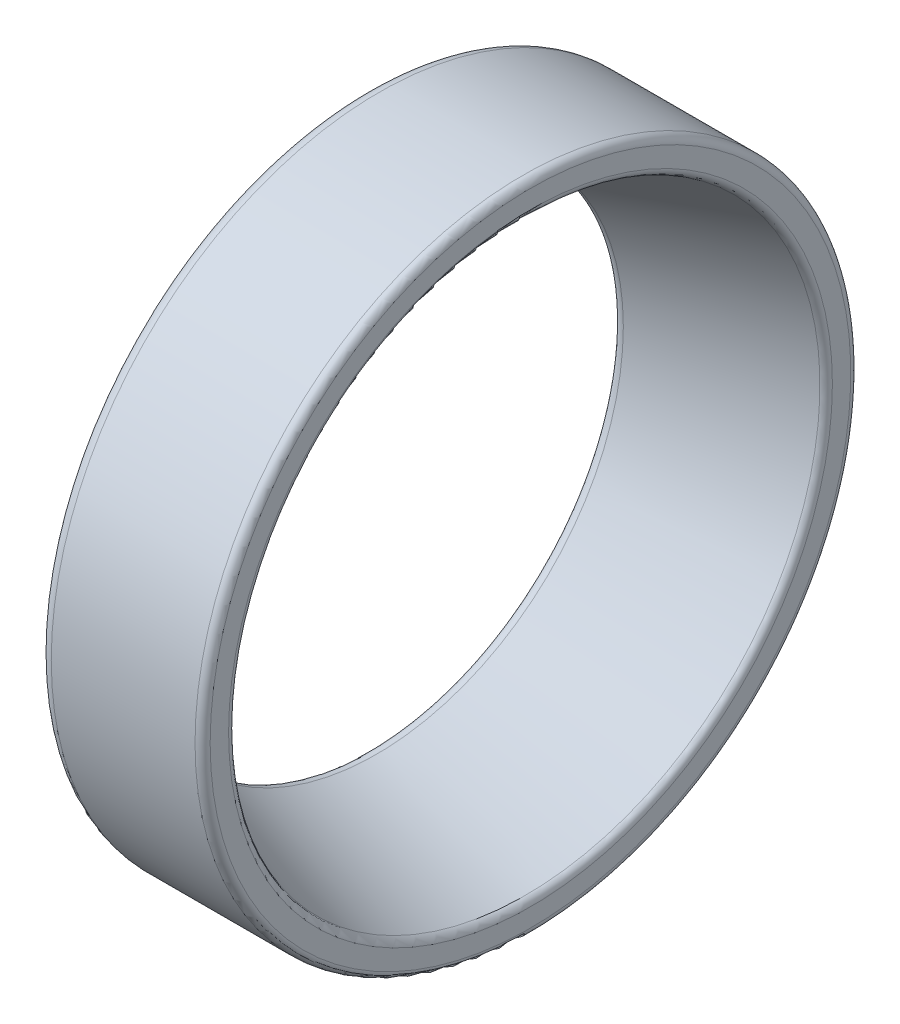
ISO-10303-21;
HEADER;
FILE_DESCRIPTION(('STEP AP214'),'2;1');
FILE_NAME('part.step','',(''),(''),'','','');
FILE_SCHEMA(('AUTOMOTIVE_DESIGN { 1 0 10303 214 1 1 1 1 }'));
ENDSEC;
DATA;
#1=APPLICATION_CONTEXT('core data for automotive mechanical design processes');
#2=APPLICATION_PROTOCOL_DEFINITION('international standard','automotive_design',2000,#1);
#3=PRODUCT_CONTEXT('',#1,'mechanical');
#4=PRODUCT('Part','Part','',(#3));
#5=PRODUCT_RELATED_PRODUCT_CATEGORY('part','',(#4));
#6=PRODUCT_DEFINITION_FORMATION('','',#4);
#7=PRODUCT_DEFINITION_CONTEXT('part definition',#1,'design');
#8=PRODUCT_DEFINITION('design','',#6,#7);
#9=PRODUCT_DEFINITION_SHAPE('','',#8);
#10=(LENGTH_UNIT() NAMED_UNIT(*) SI_UNIT(.MILLI.,.METRE.));
#11=(NAMED_UNIT(*) PLANE_ANGLE_UNIT() SI_UNIT($,.RADIAN.));
#12=(NAMED_UNIT(*) SI_UNIT($,.STERADIAN.) SOLID_ANGLE_UNIT());
#13=UNCERTAINTY_MEASURE_WITH_UNIT(LENGTH_MEASURE(1.E-05),#10,'distance_accuracy_value','');
#14=(GEOMETRIC_REPRESENTATION_CONTEXT(3) GLOBAL_UNCERTAINTY_ASSIGNED_CONTEXT((#13)) GLOBAL_UNIT_ASSIGNED_CONTEXT((#10,
#11,#12)) REPRESENTATION_CONTEXT('',''));
#15=CARTESIAN_POINT('',(0.,0.,0.));
#16=DIRECTION('',(0.,0.,1.));
#17=DIRECTION('',(1.,0.,0.));
#18=AXIS2_PLACEMENT_3D('',#15,#16,#17);
#19=CARTESIAN_POINT('',(-15.2214627778891,0.,0.));
#20=DIRECTION('',(-1.,0.,0.));
#21=DIRECTION('',(0.,0.,1.));
#22=AXIS2_PLACEMENT_3D('',#19,#20,#21);
#23=TOROIDAL_SURFACE('',#22,25.,1.);
#24=CARTESIAN_POINT('',(-16.2214627778891,0.,0.));
#25=DIRECTION('',(-1.,0.,0.));
#26=DIRECTION('',(0.,0.,1.));
#27=AXIS2_PLACEMENT_3D('',#24,#25,#26);
#28=CIRCLE('',#27,25.);
#29=CARTESIAN_POINT('',(-16.2214627778891,0.,25.));
#30=VERTEX_POINT('',#29);
#31=EDGE_CURVE('E10',#30,#30,#28,.T.);
#32=ORIENTED_EDGE('',*,*,#31,.F.);
#33=EDGE_LOOP('',(#32));
#34=FACE_BOUND('',#33,.T.);
#35=CARTESIAN_POINT('',(-15.2214627778891,0.,0.));
#36=DIRECTION('',(-1.,0.,0.));
#37=DIRECTION('',(0.,0.,1.));
#38=AXIS2_PLACEMENT_3D('',#35,#36,#37);
#39=CIRCLE('',#38,26.);
#40=CARTESIAN_POINT('',(-15.2214627778891,0.,26.));
#41=VERTEX_POINT('',#40);
#42=EDGE_CURVE('E59',#41,#41,#39,.T.);
#43=ORIENTED_EDGE('',*,*,#42,.T.);
#44=EDGE_LOOP('',(#43));
#45=FACE_BOUND('',#44,.T.);
#46=ADVANCED_FACE('F31',(#34,#45),#23,.T.);
#47=CARTESIAN_POINT('',(-16.2214627778891,20.1501289460494,0.));
#48=DIRECTION('',(1.,0.,0.));
#49=DIRECTION('',(0.,0.,-1.));
#50=AXIS2_PLACEMENT_3D('',#47,#48,#49);
#51=PLANE('',#50);
#52=CARTESIAN_POINT('',(-16.2214627778891,0.,0.));
#53=DIRECTION('',(-1.,0.,0.));
#54=DIRECTION('',(0.,0.,1.));
#55=AXIS2_PLACEMENT_3D('',#52,#53,#54);
#56=CIRCLE('',#55,20.1501289460494);
#57=CARTESIAN_POINT('',(-16.2214627778891,0.,20.1501289460494));
#58=VERTEX_POINT('',#57);
#59=EDGE_CURVE('E37',#58,#58,#56,.T.);
#60=ORIENTED_EDGE('',*,*,#59,.F.);
#61=EDGE_LOOP('',(#60));
#62=FACE_BOUND('',#61,.T.);
#63=ORIENTED_EDGE('',*,*,#31,.T.);
#64=EDGE_LOOP('',(#63));
#65=FACE_BOUND('',#64,.T.);
#66=ADVANCED_FACE('F96',(#62,#65),#51,.F.);
#67=CARTESIAN_POINT('',(-15.6214627778891,0.,0.));
#68=DIRECTION('',(-1.,0.,0.));
#69=DIRECTION('',(0.,0.,1.));
#70=AXIS2_PLACEMENT_3D('',#67,#68,#69);
#71=TOROIDAL_SURFACE('',#70,20.1501289460494,0.600000000000001);
#72=CARTESIAN_POINT('',(-15.4380361345037,0.,0.));
#73=DIRECTION('',(-1.,0.,0.));
#74=DIRECTION('',(0.,0.,1.));
#75=AXIS2_PLACEMENT_3D('',#72,#73,#74);
#76=CIRCLE('',#75,19.5788543478951);
#77=CARTESIAN_POINT('',(-15.4380361345037,0.,19.5788543478951));
#78=VERTEX_POINT('',#77);
#79=EDGE_CURVE('E41',#78,#78,#76,.T.);
#80=ORIENTED_EDGE('',*,*,#79,.F.);
#81=EDGE_LOOP('',(#80));
#82=FACE_BOUND('',#81,.T.);
#83=ORIENTED_EDGE('',*,*,#59,.T.);
#84=EDGE_LOOP('',(#83));
#85=FACE_BOUND('',#84,.T.);
#86=ADVANCED_FACE('F91',(#82,#85),#71,.T.);
#87=CARTESIAN_POINT('',(-15.4380361345037,0.,0.));
#88=DIRECTION('',(1.,0.,0.));
#89=DIRECTION('',(0.,0.,-1.));
#90=AXIS2_PLACEMENT_3D('',#87,#88,#89);
#91=CONICAL_SURFACE('',#90,19.5788543478951,0.310685166986258);
#92=CARTESIAN_POINT('',(-3.63803613450374,0.,0.));
#93=DIRECTION('',(-1.,0.,0.));
#94=DIRECTION('',(0.,0.,1.));
#95=AXIS2_PLACEMENT_3D('',#92,#93,#94);
#96=CIRCLE('',#95,23.3676354331035);
#97=CARTESIAN_POINT('',(-3.63803613450374,0.,23.3676354331035));
#98=VERTEX_POINT('',#97);
#99=EDGE_CURVE('E45',#98,#98,#96,.T.);
#100=ORIENTED_EDGE('',*,*,#99,.F.);
#101=EDGE_LOOP('',(#100));
#102=FACE_BOUND('',#101,.T.);
#103=ORIENTED_EDGE('',*,*,#79,.T.);
#104=EDGE_LOOP('',(#103));
#105=FACE_BOUND('',#104,.T.);
#106=ADVANCED_FACE('F85',(#102,#105),#91,.F.);
#107=CARTESIAN_POINT('',(-3.82146277788909,0.,0.));
#108=DIRECTION('',(-1.,0.,0.));
#109=DIRECTION('',(0.,0.,1.));
#110=AXIS2_PLACEMENT_3D('',#107,#108,#109);
#111=TOROIDAL_SURFACE('',#110,23.9389100312578,0.600000000000001);
#112=CARTESIAN_POINT('',(-3.22146277788909,0.,0.));
#113=DIRECTION('',(-1.,0.,0.));
#114=DIRECTION('',(0.,0.,1.));
#115=AXIS2_PLACEMENT_3D('',#112,#113,#114);
#116=CIRCLE('',#115,23.9389100312578);
#117=CARTESIAN_POINT('',(-3.22146277788909,0.,23.9389100312578));
#118=VERTEX_POINT('',#117);
#119=EDGE_CURVE('E50',#118,#118,#116,.T.);
#120=ORIENTED_EDGE('',*,*,#119,.F.);
#121=EDGE_LOOP('',(#120));
#122=FACE_BOUND('',#121,.T.);
#123=ORIENTED_EDGE('',*,*,#99,.T.);
#124=EDGE_LOOP('',(#123));
#125=FACE_BOUND('',#124,.T.);
#126=ADVANCED_FACE('F79',(#122,#125),#111,.T.);
#127=CARTESIAN_POINT('',(-3.22146277788909,25.4,0.));
#128=DIRECTION('',(-1.,0.,0.));
#129=DIRECTION('',(0.,0.,1.));
#130=AXIS2_PLACEMENT_3D('',#127,#128,#129);
#131=PLANE('',#130);
#132=CARTESIAN_POINT('',(-3.22146277788909,0.,0.));
#133=DIRECTION('',(-1.,0.,0.));
#134=DIRECTION('',(0.,0.,1.));
#135=AXIS2_PLACEMENT_3D('',#132,#133,#134);
#136=CIRCLE('',#135,25.4);
#137=CARTESIAN_POINT('',(-3.22146277788909,0.,25.4));
#138=VERTEX_POINT('',#137);
#139=EDGE_CURVE('E53',#138,#138,#136,.T.);
#140=ORIENTED_EDGE('',*,*,#139,.F.);
#141=EDGE_LOOP('',(#140));
#142=FACE_BOUND('',#141,.T.);
#143=ORIENTED_EDGE('',*,*,#119,.T.);
#144=EDGE_LOOP('',(#143));
#145=FACE_BOUND('',#144,.T.);
#146=ADVANCED_FACE('F73',(#142,#145),#131,.F.);
#147=CARTESIAN_POINT('',(-3.82146277788909,0.,0.));
#148=DIRECTION('',(-1.,0.,0.));
#149=DIRECTION('',(0.,0.,1.));
#150=AXIS2_PLACEMENT_3D('',#147,#148,#149);
#151=TOROIDAL_SURFACE('',#150,25.4,0.6);
#152=CARTESIAN_POINT('',(-3.82146277788909,0.,0.));
#153=DIRECTION('',(-1.,0.,0.));
#154=DIRECTION('',(0.,0.,1.));
#155=AXIS2_PLACEMENT_3D('',#152,#153,#154);
#156=CIRCLE('',#155,26.);
#157=CARTESIAN_POINT('',(-3.82146277788909,0.,26.));
#158=VERTEX_POINT('',#157);
#159=EDGE_CURVE('E56',#158,#158,#156,.T.);
#160=ORIENTED_EDGE('',*,*,#159,.F.);
#161=EDGE_LOOP('',(#160));
#162=FACE_BOUND('',#161,.T.);
#163=ORIENTED_EDGE('',*,*,#139,.T.);
#164=EDGE_LOOP('',(#163));
#165=FACE_BOUND('',#164,.T.);
#166=ADVANCED_FACE('F67',(#162,#165),#151,.T.);
#167=CARTESIAN_POINT('',(-17.9900567527011,0.,0.));
#168=DIRECTION('',(-1.,0.,0.));
#169=DIRECTION('',(0.,0.,1.));
#170=AXIS2_PLACEMENT_3D('',#167,#168,#169);
#171=CYLINDRICAL_SURFACE('',#170,26.);
#172=ORIENTED_EDGE('',*,*,#42,.F.);
#173=EDGE_LOOP('',(#172));
#174=FACE_BOUND('',#173,.T.);
#175=ORIENTED_EDGE('',*,*,#159,.T.);
#176=EDGE_LOOP('',(#175));
#177=FACE_BOUND('',#176,.T.);
#178=ADVANCED_FACE('F64',(#174,#177),#171,.T.);
#179=CLOSED_SHELL('',(#46,#66,#86,#106,#126,#146,#166,#178));
#180=MANIFOLD_SOLID_BREP('B2',#179);
#181=ADVANCED_BREP_SHAPE_REPRESENTATION('',(#18,#180),#14);
#182=SHAPE_DEFINITION_REPRESENTATION(#9,#181);
ENDSEC;
END-ISO-10303-21;
